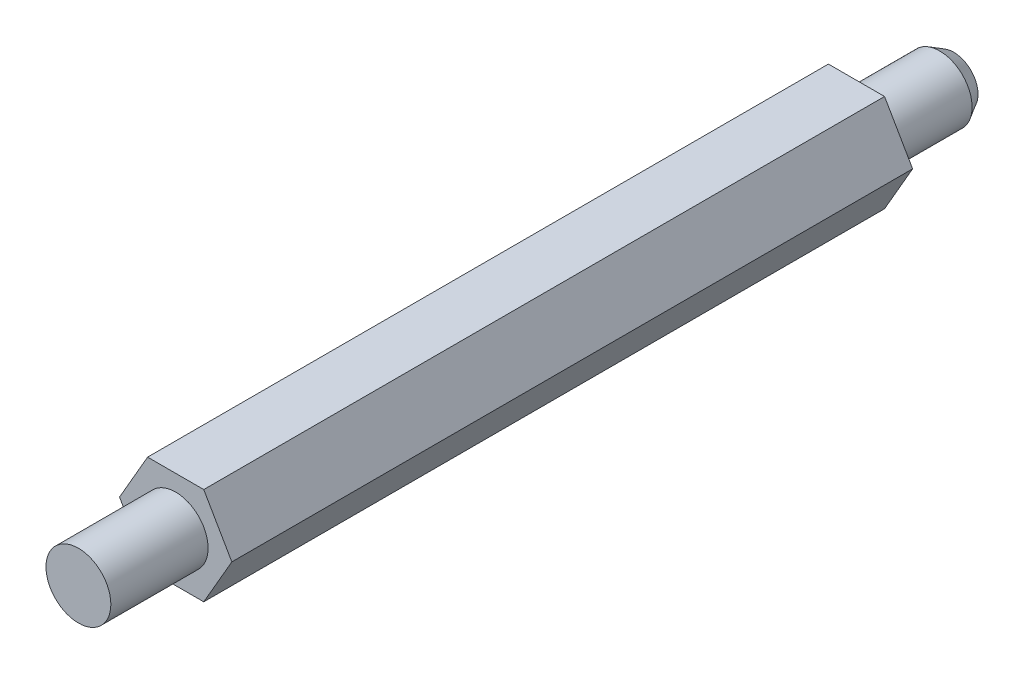
ISO-10303-21;
HEADER;
FILE_DESCRIPTION(('STEP AP214'),'2;1');
FILE_NAME('part.step','',(''),(''),'','','');
FILE_SCHEMA(('AUTOMOTIVE_DESIGN { 1 0 10303 214 1 1 1 1 }'));
ENDSEC;
DATA;
#1=APPLICATION_CONTEXT('core data for automotive mechanical design processes');
#2=APPLICATION_PROTOCOL_DEFINITION('international standard','automotive_design',2000,#1);
#3=PRODUCT_CONTEXT('',#1,'mechanical');
#4=PRODUCT('Part','Part','',(#3));
#5=PRODUCT_RELATED_PRODUCT_CATEGORY('part','',(#4));
#6=PRODUCT_DEFINITION_FORMATION('','',#4);
#7=PRODUCT_DEFINITION_CONTEXT('part definition',#1,'design');
#8=PRODUCT_DEFINITION('design','',#6,#7);
#9=PRODUCT_DEFINITION_SHAPE('','',#8);
#10=(LENGTH_UNIT() NAMED_UNIT(*) SI_UNIT(.MILLI.,.METRE.));
#11=(NAMED_UNIT(*) PLANE_ANGLE_UNIT() SI_UNIT($,.RADIAN.));
#12=(NAMED_UNIT(*) SI_UNIT($,.STERADIAN.) SOLID_ANGLE_UNIT());
#13=UNCERTAINTY_MEASURE_WITH_UNIT(LENGTH_MEASURE(1.E-05),#10,'distance_accuracy_value','');
#14=(GEOMETRIC_REPRESENTATION_CONTEXT(3) GLOBAL_UNCERTAINTY_ASSIGNED_CONTEXT((#13)) GLOBAL_UNIT_ASSIGNED_CONTEXT((#10,
#11,#12)) REPRESENTATION_CONTEXT('',''));
#15=CARTESIAN_POINT('',(0.,0.,0.));
#16=DIRECTION('',(0.,0.,1.));
#17=DIRECTION('',(1.,0.,0.));
#18=AXIS2_PLACEMENT_3D('',#15,#16,#17);
#19=CARTESIAN_POINT('',(-5.19615242270663,-3.,42.));
#20=DIRECTION('',(0.,0.,-1.));
#21=DIRECTION('',(-1.,0.,0.));
#22=AXIS2_PLACEMENT_3D('',#19,#20,#21);
#23=PLANE('',#22);
#24=DIRECTION('',(1.,0.,0.));
#25=VECTOR('',#24,1.);
#26=CARTESIAN_POINT('',(-1.73205080756888,-3.,42.));
#27=LINE('',#26,#25);
#28=CARTESIAN_POINT('',(-1.73205080756888,-3.,42.));
#29=VERTEX_POINT('',#28);
#30=CARTESIAN_POINT('',(1.73205080756888,-3.,42.));
#31=VERTEX_POINT('',#30);
#32=EDGE_CURVE('E134',#29,#31,#27,.T.);
#33=ORIENTED_EDGE('',*,*,#32,.T.);
#34=DIRECTION('',(0.5,0.866025403784439,0.));
#35=VECTOR('',#34,1.);
#36=CARTESIAN_POINT('',(1.73205080756888,-3.,42.));
#37=LINE('',#36,#35);
#38=CARTESIAN_POINT('',(3.46410161513776,0.,42.));
#39=VERTEX_POINT('',#38);
#40=EDGE_CURVE('E92',#31,#39,#37,.T.);
#41=ORIENTED_EDGE('',*,*,#40,.T.);
#42=DIRECTION('',(-0.5,0.866025403784438,0.));
#43=VECTOR('',#42,1.);
#44=CARTESIAN_POINT('',(3.46410161513776,0.,42.));
#45=LINE('',#44,#43);
#46=CARTESIAN_POINT('',(1.73205080756888,3.,42.));
#47=VERTEX_POINT('',#46);
#48=EDGE_CURVE('E105',#39,#47,#45,.T.);
#49=ORIENTED_EDGE('',*,*,#48,.T.);
#50=DIRECTION('',(-1.,0.,0.));
#51=VECTOR('',#50,1.);
#52=CARTESIAN_POINT('',(1.73205080756888,3.,42.));
#53=LINE('',#52,#51);
#54=CARTESIAN_POINT('',(-1.73205080756888,3.,42.));
#55=VERTEX_POINT('',#54);
#56=EDGE_CURVE('E99',#47,#55,#53,.T.);
#57=ORIENTED_EDGE('',*,*,#56,.T.);
#58=DIRECTION('',(-0.5,-0.866025403784439,0.));
#59=VECTOR('',#58,1.);
#60=CARTESIAN_POINT('',(-1.73205080756888,3.,42.));
#61=LINE('',#60,#59);
#62=CARTESIAN_POINT('',(-3.46410161513775,0.,42.));
#63=VERTEX_POINT('',#62);
#64=EDGE_CURVE('E103',#55,#63,#61,.T.);
#65=ORIENTED_EDGE('',*,*,#64,.T.);
#66=DIRECTION('',(0.5,-0.866025403784438,0.));
#67=VECTOR('',#66,1.);
#68=CARTESIAN_POINT('',(-3.46410161513775,0.,42.));
#69=LINE('',#68,#67);
#70=EDGE_CURVE('E54',#63,#29,#69,.T.);
#71=ORIENTED_EDGE('',*,*,#70,.T.);
#72=EDGE_LOOP('',(#33,#41,#49,#57,#65,#71));
#73=FACE_BOUND('',#72,.T.);
#74=CARTESIAN_POINT('',(0.,0.,42.));
#75=DIRECTION('',(0.,0.,-1.));
#76=DIRECTION('',(-1.,0.,0.));
#77=AXIS2_PLACEMENT_3D('',#74,#75,#76);
#78=CIRCLE('',#77,2.);
#79=CARTESIAN_POINT('',(-2.,0.,42.));
#80=VERTEX_POINT('',#79);
#81=EDGE_CURVE('E143',#80,#80,#78,.F.);
#82=ORIENTED_EDGE('',*,*,#81,.F.);
#83=EDGE_LOOP('',(#82));
#84=FACE_BOUND('',#83,.T.);
#85=ADVANCED_FACE('F37',(#73,#84),#23,.F.);
#86=CARTESIAN_POINT('',(-5.19615242270663,-3.,0.));
#87=DIRECTION('',(0.,0.,-1.));
#88=DIRECTION('',(-1.,0.,0.));
#89=AXIS2_PLACEMENT_3D('',#86,#87,#88);
#90=PLANE('',#89);
#91=DIRECTION('',(1.,0.,0.));
#92=VECTOR('',#91,1.);
#93=CARTESIAN_POINT('',(-1.73205080756888,-3.,0.));
#94=LINE('',#93,#92);
#95=CARTESIAN_POINT('',(-1.73205080756888,-3.,0.));
#96=VERTEX_POINT('',#95);
#97=CARTESIAN_POINT('',(1.73205080756888,-3.,0.));
#98=VERTEX_POINT('',#97);
#99=EDGE_CURVE('E123',#96,#98,#94,.T.);
#100=ORIENTED_EDGE('',*,*,#99,.F.);
#101=DIRECTION('',(0.5,-0.866025403784438,0.));
#102=VECTOR('',#101,1.);
#103=CARTESIAN_POINT('',(-3.46410161513775,0.,0.));
#104=LINE('',#103,#102);
#105=CARTESIAN_POINT('',(-3.46410161513775,0.,0.));
#106=VERTEX_POINT('',#105);
#107=EDGE_CURVE('E83',#106,#96,#104,.T.);
#108=ORIENTED_EDGE('',*,*,#107,.F.);
#109=DIRECTION('',(-0.5,-0.866025403784439,0.));
#110=VECTOR('',#109,1.);
#111=CARTESIAN_POINT('',(-1.73205080756888,3.,0.));
#112=LINE('',#111,#110);
#113=CARTESIAN_POINT('',(-1.73205080756888,3.,0.));
#114=VERTEX_POINT('',#113);
#115=EDGE_CURVE('E77',#114,#106,#112,.T.);
#116=ORIENTED_EDGE('',*,*,#115,.F.);
#117=DIRECTION('',(-1.,0.,0.));
#118=VECTOR('',#117,1.);
#119=CARTESIAN_POINT('',(1.73205080756888,3.,0.));
#120=LINE('',#119,#118);
#121=CARTESIAN_POINT('',(1.73205080756888,3.,0.));
#122=VERTEX_POINT('',#121);
#123=EDGE_CURVE('E113',#122,#114,#120,.T.);
#124=ORIENTED_EDGE('',*,*,#123,.F.);
#125=DIRECTION('',(-0.5,0.866025403784438,0.));
#126=VECTOR('',#125,1.);
#127=CARTESIAN_POINT('',(3.46410161513776,0.,0.));
#128=LINE('',#127,#126);
#129=CARTESIAN_POINT('',(3.46410161513776,0.,0.));
#130=VERTEX_POINT('',#129);
#131=EDGE_CURVE('E129',#130,#122,#128,.T.);
#132=ORIENTED_EDGE('',*,*,#131,.F.);
#133=DIRECTION('',(0.5,0.866025403784439,0.));
#134=VECTOR('',#133,1.);
#135=CARTESIAN_POINT('',(1.73205080756888,-3.,0.));
#136=LINE('',#135,#134);
#137=EDGE_CURVE('E126',#98,#130,#136,.T.);
#138=ORIENTED_EDGE('',*,*,#137,.F.);
#139=EDGE_LOOP('',(#100,#108,#116,#124,#132,#138));
#140=FACE_BOUND('',#139,.T.);
#141=CARTESIAN_POINT('',(0.,0.,0.));
#142=DIRECTION('',(0.,0.,-1.));
#143=DIRECTION('',(-1.,0.,0.));
#144=AXIS2_PLACEMENT_3D('',#141,#142,#143);
#145=CIRCLE('',#144,2.);
#146=CARTESIAN_POINT('',(-2.,0.,0.));
#147=VERTEX_POINT('',#146);
#148=EDGE_CURVE('E127',#147,#147,#145,.F.);
#149=ORIENTED_EDGE('',*,*,#148,.T.);
#150=EDGE_LOOP('',(#149));
#151=FACE_BOUND('',#150,.T.);
#152=ADVANCED_FACE('F164',(#140,#151),#90,.T.);
#153=CARTESIAN_POINT('',(-1.73205080756888,-3.,42.));
#154=DIRECTION('',(0.,1.,0.));
#155=DIRECTION('',(0.,0.,1.));
#156=AXIS2_PLACEMENT_3D('',#153,#154,#155);
#157=PLANE('',#156);
#158=ORIENTED_EDGE('',*,*,#99,.T.);
#159=DIRECTION('',(0.,0.,-1.));
#160=VECTOR('',#159,1.);
#161=CARTESIAN_POINT('',(1.73205080756888,-3.,42.));
#162=LINE('',#161,#160);
#163=EDGE_CURVE('E141',#31,#98,#162,.T.);
#164=ORIENTED_EDGE('',*,*,#163,.F.);
#165=ORIENTED_EDGE('',*,*,#32,.F.);
#166=DIRECTION('',(0.,0.,-1.));
#167=VECTOR('',#166,1.);
#168=CARTESIAN_POINT('',(-1.73205080756888,-3.,42.));
#169=LINE('',#168,#167);
#170=EDGE_CURVE('E119',#29,#96,#169,.T.);
#171=ORIENTED_EDGE('',*,*,#170,.T.);
#172=EDGE_LOOP('',(#158,#164,#165,#171));
#173=FACE_BOUND('',#172,.T.);
#174=ADVANCED_FACE('F167',(#173),#157,.F.);
#175=CARTESIAN_POINT('',(1.73205080756888,-3.,42.));
#176=DIRECTION('',(-0.866025403784439,0.5,0.));
#177=DIRECTION('',(-0.5,-0.866025403784439,0.));
#178=AXIS2_PLACEMENT_3D('',#175,#176,#177);
#179=PLANE('',#178);
#180=ORIENTED_EDGE('',*,*,#137,.T.);
#181=DIRECTION('',(0.,0.,-1.));
#182=VECTOR('',#181,1.);
#183=CARTESIAN_POINT('',(3.46410161513776,0.,42.));
#184=LINE('',#183,#182);
#185=EDGE_CURVE('E138',#39,#130,#184,.T.);
#186=ORIENTED_EDGE('',*,*,#185,.F.);
#187=ORIENTED_EDGE('',*,*,#40,.F.);
#188=ORIENTED_EDGE('',*,*,#163,.T.);
#189=EDGE_LOOP('',(#180,#186,#187,#188));
#190=FACE_BOUND('',#189,.T.);
#191=ADVANCED_FACE('F158',(#190),#179,.F.);
#192=CARTESIAN_POINT('',(3.46410161513776,0.,42.));
#193=DIRECTION('',(-0.866025403784438,-0.5,0.));
#194=DIRECTION('',(0.5,-0.866025403784439,0.));
#195=AXIS2_PLACEMENT_3D('',#192,#193,#194);
#196=PLANE('',#195);
#197=ORIENTED_EDGE('',*,*,#131,.T.);
#198=DIRECTION('',(0.,0.,-1.));
#199=VECTOR('',#198,1.);
#200=CARTESIAN_POINT('',(1.73205080756888,3.,42.));
#201=LINE('',#200,#199);
#202=EDGE_CURVE('E114',#47,#122,#201,.T.);
#203=ORIENTED_EDGE('',*,*,#202,.F.);
#204=ORIENTED_EDGE('',*,*,#48,.F.);
#205=ORIENTED_EDGE('',*,*,#185,.T.);
#206=EDGE_LOOP('',(#197,#203,#204,#205));
#207=FACE_BOUND('',#206,.T.);
#208=ADVANCED_FACE('F161',(#207),#196,.F.);
#209=CARTESIAN_POINT('',(1.73205080756888,3.,42.));
#210=DIRECTION('',(0.,-1.,0.));
#211=DIRECTION('',(1.,0.,0.));
#212=AXIS2_PLACEMENT_3D('',#209,#210,#211);
#213=PLANE('',#212);
#214=ORIENTED_EDGE('',*,*,#123,.T.);
#215=DIRECTION('',(0.,0.,-1.));
#216=VECTOR('',#215,1.);
#217=CARTESIAN_POINT('',(-1.73205080756888,3.,42.));
#218=LINE('',#217,#216);
#219=EDGE_CURVE('E110',#55,#114,#218,.T.);
#220=ORIENTED_EDGE('',*,*,#219,.F.);
#221=ORIENTED_EDGE('',*,*,#56,.F.);
#222=ORIENTED_EDGE('',*,*,#202,.T.);
#223=EDGE_LOOP('',(#214,#220,#221,#222));
#224=FACE_BOUND('',#223,.T.);
#225=ADVANCED_FACE('F111',(#224),#213,.F.);
#226=CARTESIAN_POINT('',(-1.73205080756888,3.,42.));
#227=DIRECTION('',(0.866025403784439,-0.5,0.));
#228=DIRECTION('',(0.5,0.866025403784439,0.));
#229=AXIS2_PLACEMENT_3D('',#226,#227,#228);
#230=PLANE('',#229);
#231=ORIENTED_EDGE('',*,*,#115,.T.);
#232=DIRECTION('',(0.,0.,-1.));
#233=VECTOR('',#232,1.);
#234=CARTESIAN_POINT('',(-3.46410161513775,0.,42.));
#235=LINE('',#234,#233);
#236=EDGE_CURVE('E115',#63,#106,#235,.T.);
#237=ORIENTED_EDGE('',*,*,#236,.F.);
#238=ORIENTED_EDGE('',*,*,#64,.F.);
#239=ORIENTED_EDGE('',*,*,#219,.T.);
#240=EDGE_LOOP('',(#231,#237,#238,#239));
#241=FACE_BOUND('',#240,.T.);
#242=ADVANCED_FACE('F117',(#241),#230,.F.);
#243=CARTESIAN_POINT('',(-3.46410161513775,0.,42.));
#244=DIRECTION('',(0.866025403784439,0.5,0.));
#245=DIRECTION('',(-0.5,0.866025403784438,0.));
#246=AXIS2_PLACEMENT_3D('',#243,#244,#245);
#247=PLANE('',#246);
#248=ORIENTED_EDGE('',*,*,#107,.T.);
#249=ORIENTED_EDGE('',*,*,#170,.F.);
#250=ORIENTED_EDGE('',*,*,#70,.F.);
#251=ORIENTED_EDGE('',*,*,#236,.T.);
#252=EDGE_LOOP('',(#248,#249,#250,#251));
#253=FACE_BOUND('',#252,.T.);
#254=ADVANCED_FACE('F168',(#253),#247,.F.);
#255=CARTESIAN_POINT('',(-5.19615242270663,-3.,-6.));
#256=DIRECTION('',(0.,0.,-1.));
#257=DIRECTION('',(-1.,0.,0.));
#258=AXIS2_PLACEMENT_3D('',#255,#256,#257);
#259=PLANE('',#258);
#260=CARTESIAN_POINT('',(0.,0.,-6.));
#261=DIRECTION('',(0.,0.,-1.));
#262=DIRECTION('',(-1.,0.,0.));
#263=AXIS2_PLACEMENT_3D('',#260,#261,#262);
#264=CIRCLE('',#263,1.50000000000001);
#265=CARTESIAN_POINT('',(-1.50000000000001,0.,-6.));
#266=VERTEX_POINT('',#265);
#267=EDGE_CURVE('E12',#266,#266,#264,.T.);
#268=ORIENTED_EDGE('',*,*,#267,.T.);
#269=EDGE_LOOP('',(#268));
#270=FACE_BOUND('',#269,.T.);
#271=ADVANCED_FACE('F170',(#270),#259,.T.);
#272=CARTESIAN_POINT('',(0.,0.,48.));
#273=DIRECTION('',(0.,0.,-1.));
#274=DIRECTION('',(-1.,0.,0.));
#275=AXIS2_PLACEMENT_3D('',#272,#273,#274);
#276=CYLINDRICAL_SURFACE('',#275,2.);
#277=CARTESIAN_POINT('',(0.,0.,-5.13397459621558));
#278=DIRECTION('',(0.,0.,-1.));
#279=DIRECTION('',(-1.,0.,0.));
#280=AXIS2_PLACEMENT_3D('',#277,#278,#279);
#281=CIRCLE('',#280,2.);
#282=CARTESIAN_POINT('',(-2.,0.,-5.13397459621558));
#283=VERTEX_POINT('',#282);
#284=EDGE_CURVE('E46',#283,#283,#281,.F.);
#285=ORIENTED_EDGE('',*,*,#284,.T.);
#286=EDGE_LOOP('',(#285));
#287=FACE_BOUND('',#286,.T.);
#288=ORIENTED_EDGE('',*,*,#148,.F.);
#289=EDGE_LOOP('',(#288));
#290=FACE_BOUND('',#289,.T.);
#291=ADVANCED_FACE('F176',(#287,#290),#276,.T.);
#292=CARTESIAN_POINT('',(0.,0.,48.));
#293=DIRECTION('',(0.,0.,1.));
#294=DIRECTION('',(1.,0.,0.));
#295=AXIS2_PLACEMENT_3D('',#292,#293,#294);
#296=CIRCLE('',#295,2.);
#297=CARTESIAN_POINT('',(2.,0.,48.));
#298=VERTEX_POINT('',#297);
#299=EDGE_CURVE('E145',#298,#298,#296,.T.);
#300=ORIENTED_EDGE('',*,*,#299,.F.);
#301=EDGE_LOOP('',(#300));
#302=FACE_BOUND('',#301,.T.);
#303=ORIENTED_EDGE('',*,*,#81,.T.);
#304=EDGE_LOOP('',(#303));
#305=FACE_BOUND('',#304,.T.);
#306=ADVANCED_FACE('F189',(#302,#305),#276,.T.);
#307=CARTESIAN_POINT('',(0.,0.,48.));
#308=DIRECTION('',(0.,0.,1.));
#309=DIRECTION('',(1.,0.,0.));
#310=AXIS2_PLACEMENT_3D('',#307,#308,#309);
#311=PLANE('',#310);
#312=ORIENTED_EDGE('',*,*,#299,.T.);
#313=EDGE_LOOP('',(#312));
#314=FACE_BOUND('',#313,.T.);
#315=ADVANCED_FACE('F190',(#314),#311,.T.);
#316=CARTESIAN_POINT('',(0.,0.,-5.13397459621558));
#317=DIRECTION('',(0.,0.,1.));
#318=DIRECTION('',(1.,0.,0.));
#319=AXIS2_PLACEMENT_3D('',#316,#317,#318);
#320=CONICAL_SURFACE('',#319,2.,0.5235987755983);
#321=ORIENTED_EDGE('',*,*,#267,.F.);
#322=EDGE_LOOP('',(#321));
#323=FACE_BOUND('',#322,.T.);
#324=ORIENTED_EDGE('',*,*,#284,.F.);
#325=EDGE_LOOP('',(#324));
#326=FACE_BOUND('',#325,.T.);
#327=ADVANCED_FACE('F39',(#323,#326),#320,.T.);
#328=CLOSED_SHELL('',(#85,#152,#174,#191,#208,#225,#242,#254,#271,#291,#306,#315,#327));
#329=MANIFOLD_SOLID_BREP('B2',#328);
#330=ADVANCED_BREP_SHAPE_REPRESENTATION('',(#18,#329),#14);
#331=SHAPE_DEFINITION_REPRESENTATION(#9,#330);
ENDSEC;
END-ISO-10303-21;
